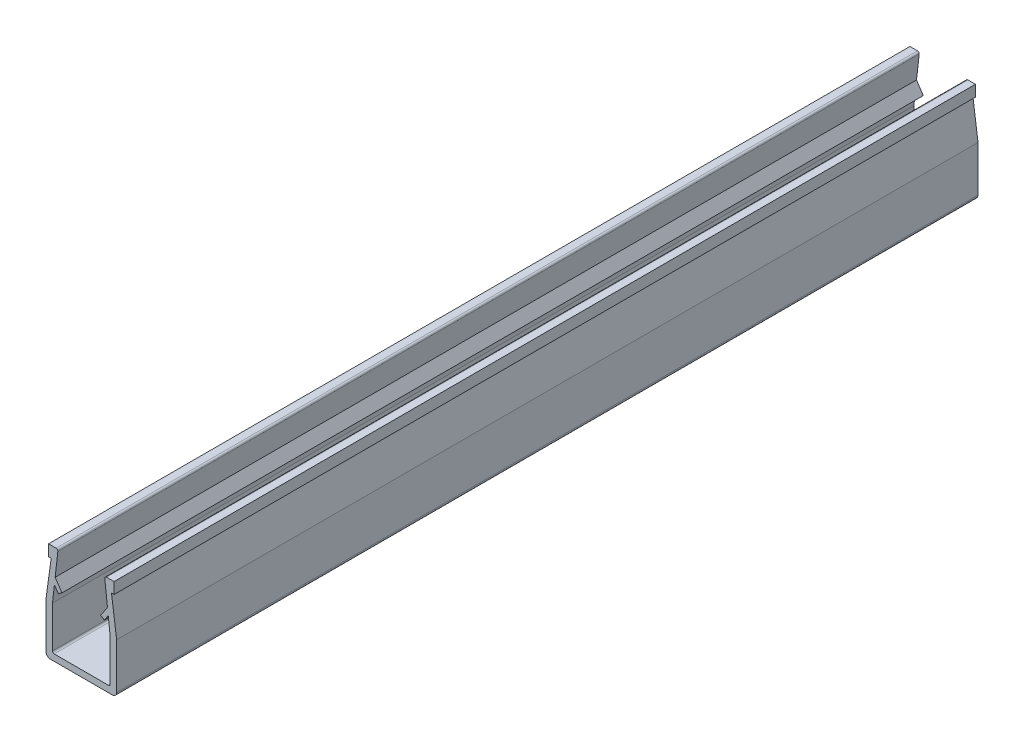
ISO-10303-21;
HEADER;
FILE_DESCRIPTION(('STEP AP214'),'2;1');
FILE_NAME('part.step','',(''),(''),'','','');
FILE_SCHEMA(('AUTOMOTIVE_DESIGN { 1 0 10303 214 1 1 1 1 }'));
ENDSEC;
DATA;
#1=APPLICATION_CONTEXT('core data for automotive mechanical design processes');
#2=APPLICATION_PROTOCOL_DEFINITION('international standard','automotive_design',2000,#1);
#3=PRODUCT_CONTEXT('',#1,'mechanical');
#4=PRODUCT('Part','Part','',(#3));
#5=PRODUCT_RELATED_PRODUCT_CATEGORY('part','',(#4));
#6=PRODUCT_DEFINITION_FORMATION('','',#4);
#7=PRODUCT_DEFINITION_CONTEXT('part definition',#1,'design');
#8=PRODUCT_DEFINITION('design','',#6,#7);
#9=PRODUCT_DEFINITION_SHAPE('','',#8);
#10=(LENGTH_UNIT() NAMED_UNIT(*) SI_UNIT(.MILLI.,.METRE.));
#11=(NAMED_UNIT(*) PLANE_ANGLE_UNIT() SI_UNIT($,.RADIAN.));
#12=(NAMED_UNIT(*) SI_UNIT($,.STERADIAN.) SOLID_ANGLE_UNIT());
#13=UNCERTAINTY_MEASURE_WITH_UNIT(LENGTH_MEASURE(1.E-05),#10,'distance_accuracy_value','');
#14=(GEOMETRIC_REPRESENTATION_CONTEXT(3) GLOBAL_UNCERTAINTY_ASSIGNED_CONTEXT((#13)) GLOBAL_UNIT_ASSIGNED_CONTEXT((#10,
#11,#12)) REPRESENTATION_CONTEXT('',''));
#15=CARTESIAN_POINT('',(0.,0.,0.));
#16=DIRECTION('',(0.,0.,1.));
#17=DIRECTION('',(1.,0.,0.));
#18=AXIS2_PLACEMENT_3D('',#15,#16,#17);
#19=CARTESIAN_POINT('',(0.,-1.29999999999995,100.));
#20=DIRECTION('',(0.,1.,0.));
#21=DIRECTION('',(0.,0.,1.));
#22=AXIS2_PLACEMENT_3D('',#19,#20,#21);
#23=PLANE('',#22);
#24=DIRECTION('',(1.,0.,0.));
#25=VECTOR('',#24,1.);
#26=CARTESIAN_POINT('',(0.,-1.29999999999995,0.));
#27=LINE('',#26,#25);
#28=CARTESIAN_POINT('',(0.,-1.29999999999995,0.));
#29=VERTEX_POINT('',#28);
#30=CARTESIAN_POINT('',(0.29826662995589,-1.29999999999995,0.));
#31=VERTEX_POINT('',#30);
#32=EDGE_CURVE('E263',#29,#31,#27,.T.);
#33=ORIENTED_EDGE('',*,*,#32,.T.);
#34=DIRECTION('',(0.,0.,-1.));
#35=VECTOR('',#34,1.);
#36=CARTESIAN_POINT('',(0.29826662995589,-1.29999999999995,100.));
#37=LINE('',#36,#35);
#38=CARTESIAN_POINT('',(0.29826662995589,-1.29999999999995,100.));
#39=VERTEX_POINT('',#38);
#40=EDGE_CURVE('E11',#39,#31,#37,.T.);
#41=ORIENTED_EDGE('',*,*,#40,.F.);
#42=DIRECTION('',(1.,0.,0.));
#43=VECTOR('',#42,1.);
#44=CARTESIAN_POINT('',(0.,-1.29999999999995,100.));
#45=LINE('',#44,#43);
#46=CARTESIAN_POINT('',(0.,-1.29999999999995,100.));
#47=VERTEX_POINT('',#46);
#48=EDGE_CURVE('E321',#47,#39,#45,.T.);
#49=ORIENTED_EDGE('',*,*,#48,.F.);
#50=DIRECTION('',(0.,0.,-1.));
#51=VECTOR('',#50,1.);
#52=CARTESIAN_POINT('',(0.,-1.29999999999995,100.));
#53=LINE('',#52,#51);
#54=EDGE_CURVE('E259',#47,#29,#53,.T.);
#55=ORIENTED_EDGE('',*,*,#54,.T.);
#56=EDGE_LOOP('',(#33,#41,#49,#55));
#57=FACE_BOUND('',#56,.T.);
#58=ADVANCED_FACE('F35',(#57),#23,.F.);
#59=CARTESIAN_POINT('',(-0.300000000000011,-5.70774326499407,100.));
#60=DIRECTION('',(0.99091392418748,-0.134497564481178,0.));
#61=DIRECTION('',(0.134497564481178,0.99091392418748,0.));
#62=AXIS2_PLACEMENT_3D('',#59,#60,#61);
#63=PLANE('',#62);
#64=DIRECTION('',(-0.134497564481178,-0.99091392418748,0.));
#65=VECTOR('',#64,1.);
#66=CARTESIAN_POINT('',(-0.300000000000011,-5.70774326499407,0.));
#67=LINE('',#66,#65);
#68=CARTESIAN_POINT('',(-0.300000000000011,-5.70774326499407,0.));
#69=VERTEX_POINT('',#68);
#70=EDGE_CURVE('E266',#31,#69,#67,.T.);
#71=ORIENTED_EDGE('',*,*,#70,.T.);
#72=DIRECTION('',(0.,0.,-1.));
#73=VECTOR('',#72,1.);
#74=CARTESIAN_POINT('',(-0.300000000000011,-5.70774326499407,100.));
#75=LINE('',#74,#73);
#76=CARTESIAN_POINT('',(-0.300000000000011,-5.70774326499407,100.));
#77=VERTEX_POINT('',#76);
#78=EDGE_CURVE('E43',#77,#69,#75,.T.);
#79=ORIENTED_EDGE('',*,*,#78,.F.);
#80=DIRECTION('',(-0.134497564481178,-0.99091392418748,0.));
#81=VECTOR('',#80,1.);
#82=CARTESIAN_POINT('',(-0.300000000000011,-5.70774326499407,100.));
#83=LINE('',#82,#81);
#84=EDGE_CURVE('E160',#39,#77,#83,.T.);
#85=ORIENTED_EDGE('',*,*,#84,.F.);
#86=ORIENTED_EDGE('',*,*,#40,.T.);
#87=EDGE_LOOP('',(#71,#79,#85,#86));
#88=FACE_BOUND('',#87,.T.);
#89=ADVANCED_FACE('F489',(#88),#63,.F.);
#90=CARTESIAN_POINT('',(-0.299999999999898,-11.,100.));
#91=DIRECTION('',(1.,0.,0.));
#92=DIRECTION('',(0.,1.,0.));
#93=AXIS2_PLACEMENT_3D('',#90,#91,#92);
#94=PLANE('',#93);
#95=DIRECTION('',(0.,-1.,0.));
#96=VECTOR('',#95,1.);
#97=CARTESIAN_POINT('',(-0.299999999999898,-11.,0.));
#98=LINE('',#97,#96);
#99=CARTESIAN_POINT('',(-0.299999999999898,-11.,0.));
#100=VERTEX_POINT('',#99);
#101=EDGE_CURVE('E268',#69,#100,#98,.T.);
#102=ORIENTED_EDGE('',*,*,#101,.T.);
#103=DIRECTION('',(0.,0.,-1.));
#104=VECTOR('',#103,1.);
#105=CARTESIAN_POINT('',(-0.299999999999898,-11.,100.));
#106=LINE('',#105,#104);
#107=CARTESIAN_POINT('',(-0.299999999999898,-11.,100.));
#108=VERTEX_POINT('',#107);
#109=EDGE_CURVE('E394',#108,#100,#106,.T.);
#110=ORIENTED_EDGE('',*,*,#109,.F.);
#111=DIRECTION('',(0.,-1.,0.));
#112=VECTOR('',#111,1.);
#113=CARTESIAN_POINT('',(-0.299999999999898,-11.,100.));
#114=LINE('',#113,#112);
#115=EDGE_CURVE('E402',#77,#108,#114,.T.);
#116=ORIENTED_EDGE('',*,*,#115,.F.);
#117=ORIENTED_EDGE('',*,*,#78,.T.);
#118=EDGE_LOOP('',(#102,#110,#116,#117));
#119=FACE_BOUND('',#118,.T.);
#120=ADVANCED_FACE('F400',(#119),#94,.F.);
#121=CARTESIAN_POINT('',(0.200000000000102,-11.,100.));
#122=DIRECTION('',(0.,0.,-1.));
#123=DIRECTION('',(-1.,0.,0.));
#124=AXIS2_PLACEMENT_3D('',#121,#122,#123);
#125=CYLINDRICAL_SURFACE('',#124,0.5);
#126=CARTESIAN_POINT('',(0.200000000000102,-11.,0.));
#127=DIRECTION('',(0.,0.,1.));
#128=DIRECTION('',(1.,0.,0.));
#129=AXIS2_PLACEMENT_3D('',#126,#127,#128);
#130=CIRCLE('',#129,0.5);
#131=CARTESIAN_POINT('',(0.200000000000102,-11.5,0.));
#132=VERTEX_POINT('',#131);
#133=EDGE_CURVE('E270',#100,#132,#130,.T.);
#134=ORIENTED_EDGE('',*,*,#133,.T.);
#135=DIRECTION('',(0.,0.,-1.));
#136=VECTOR('',#135,1.);
#137=CARTESIAN_POINT('',(0.200000000000102,-11.5,100.));
#138=LINE('',#137,#136);
#139=CARTESIAN_POINT('',(0.200000000000102,-11.5,100.));
#140=VERTEX_POINT('',#139);
#141=EDGE_CURVE('E391',#140,#132,#138,.T.);
#142=ORIENTED_EDGE('',*,*,#141,.F.);
#143=CARTESIAN_POINT('',(0.200000000000102,-11.,100.));
#144=DIRECTION('',(0.,0.,1.));
#145=DIRECTION('',(1.,0.,0.));
#146=AXIS2_PLACEMENT_3D('',#143,#144,#145);
#147=CIRCLE('',#146,0.5);
#148=EDGE_CURVE('E420',#108,#140,#147,.T.);
#149=ORIENTED_EDGE('',*,*,#148,.F.);
#150=ORIENTED_EDGE('',*,*,#109,.T.);
#151=EDGE_LOOP('',(#134,#142,#149,#150));
#152=FACE_BOUND('',#151,.T.);
#153=ADVANCED_FACE('F411',(#152),#125,.T.);
#154=CARTESIAN_POINT('',(7.39999999999992,-11.5,100.));
#155=DIRECTION('',(0.,1.,0.));
#156=DIRECTION('',(0.,0.,1.));
#157=AXIS2_PLACEMENT_3D('',#154,#155,#156);
#158=PLANE('',#157);
#159=DIRECTION('',(1.,0.,0.));
#160=VECTOR('',#159,1.);
#161=CARTESIAN_POINT('',(7.39999999999992,-11.5,0.));
#162=LINE('',#161,#160);
#163=CARTESIAN_POINT('',(7.39999999999992,-11.5,0.));
#164=VERTEX_POINT('',#163);
#165=EDGE_CURVE('E272',#132,#164,#162,.T.);
#166=ORIENTED_EDGE('',*,*,#165,.T.);
#167=DIRECTION('',(0.,0.,-1.));
#168=VECTOR('',#167,1.);
#169=CARTESIAN_POINT('',(7.39999999999992,-11.5,100.));
#170=LINE('',#169,#168);
#171=CARTESIAN_POINT('',(7.39999999999992,-11.5,100.));
#172=VERTEX_POINT('',#171);
#173=EDGE_CURVE('E388',#172,#164,#170,.T.);
#174=ORIENTED_EDGE('',*,*,#173,.F.);
#175=DIRECTION('',(1.,0.,0.));
#176=VECTOR('',#175,1.);
#177=CARTESIAN_POINT('',(7.39999999999992,-11.5,100.));
#178=LINE('',#177,#176);
#179=EDGE_CURVE('E417',#140,#172,#178,.T.);
#180=ORIENTED_EDGE('',*,*,#179,.F.);
#181=ORIENTED_EDGE('',*,*,#141,.T.);
#182=EDGE_LOOP('',(#166,#174,#180,#181));
#183=FACE_BOUND('',#182,.T.);
#184=ADVANCED_FACE('F415',(#183),#158,.F.);
#185=CARTESIAN_POINT('',(7.39999999999992,-11.,100.));
#186=DIRECTION('',(0.,0.,-1.));
#187=DIRECTION('',(-1.,0.,0.));
#188=AXIS2_PLACEMENT_3D('',#185,#186,#187);
#189=CYLINDRICAL_SURFACE('',#188,0.5);
#190=CARTESIAN_POINT('',(7.39999999999992,-11.,0.));
#191=DIRECTION('',(0.,0.,1.));
#192=DIRECTION('',(1.,0.,0.));
#193=AXIS2_PLACEMENT_3D('',#190,#191,#192);
#194=CIRCLE('',#193,0.5);
#195=CARTESIAN_POINT('',(7.89999999999992,-11.,0.));
#196=VERTEX_POINT('',#195);
#197=EDGE_CURVE('E274',#164,#196,#194,.T.);
#198=ORIENTED_EDGE('',*,*,#197,.T.);
#199=DIRECTION('',(0.,0.,-1.));
#200=VECTOR('',#199,1.);
#201=CARTESIAN_POINT('',(7.89999999999992,-11.,100.));
#202=LINE('',#201,#200);
#203=CARTESIAN_POINT('',(7.89999999999992,-11.,100.));
#204=VERTEX_POINT('',#203);
#205=EDGE_CURVE('E385',#204,#196,#202,.T.);
#206=ORIENTED_EDGE('',*,*,#205,.F.);
#207=CARTESIAN_POINT('',(7.39999999999992,-11.,100.));
#208=DIRECTION('',(0.,0.,1.));
#209=DIRECTION('',(1.,0.,0.));
#210=AXIS2_PLACEMENT_3D('',#207,#208,#209);
#211=CIRCLE('',#210,0.5);
#212=EDGE_CURVE('E419',#172,#204,#211,.T.);
#213=ORIENTED_EDGE('',*,*,#212,.F.);
#214=ORIENTED_EDGE('',*,*,#173,.T.);
#215=EDGE_LOOP('',(#198,#206,#213,#214));
#216=FACE_BOUND('',#215,.T.);
#217=ADVANCED_FACE('F502',(#216),#189,.T.);
#218=CARTESIAN_POINT('',(7.90000000000003,-5.70774326499407,100.));
#219=DIRECTION('',(-1.,0.,0.));
#220=DIRECTION('',(0.,-1.,0.));
#221=AXIS2_PLACEMENT_3D('',#218,#219,#220);
#222=PLANE('',#221);
#223=DIRECTION('',(0.,1.,0.));
#224=VECTOR('',#223,1.);
#225=CARTESIAN_POINT('',(7.90000000000003,-5.70774326499407,0.));
#226=LINE('',#225,#224);
#227=CARTESIAN_POINT('',(7.90000000000003,-5.70774326499407,0.));
#228=VERTEX_POINT('',#227);
#229=EDGE_CURVE('E276',#196,#228,#226,.T.);
#230=ORIENTED_EDGE('',*,*,#229,.T.);
#231=DIRECTION('',(0.,0.,-1.));
#232=VECTOR('',#231,1.);
#233=CARTESIAN_POINT('',(7.90000000000003,-5.70774326499407,100.));
#234=LINE('',#233,#232);
#235=CARTESIAN_POINT('',(7.90000000000003,-5.70774326499407,100.));
#236=VERTEX_POINT('',#235);
#237=EDGE_CURVE('E382',#236,#228,#234,.T.);
#238=ORIENTED_EDGE('',*,*,#237,.F.);
#239=DIRECTION('',(0.,1.,0.));
#240=VECTOR('',#239,1.);
#241=CARTESIAN_POINT('',(7.90000000000003,-5.70774326499407,100.));
#242=LINE('',#241,#240);
#243=EDGE_CURVE('E422',#204,#236,#242,.T.);
#244=ORIENTED_EDGE('',*,*,#243,.F.);
#245=ORIENTED_EDGE('',*,*,#205,.T.);
#246=EDGE_LOOP('',(#230,#238,#244,#245));
#247=FACE_BOUND('',#246,.T.);
#248=ADVANCED_FACE('F505',(#247),#222,.F.);
#249=CARTESIAN_POINT('',(7.30173337004413,-1.29999999999995,100.));
#250=DIRECTION('',(-0.99091392418748,-0.134497564481177,0.));
#251=DIRECTION('',(0.134497564481177,-0.99091392418748,0.));
#252=AXIS2_PLACEMENT_3D('',#249,#250,#251);
#253=PLANE('',#252);
#254=DIRECTION('',(-0.134497564481177,0.99091392418748,0.));
#255=VECTOR('',#254,1.);
#256=CARTESIAN_POINT('',(7.30173337004413,-1.29999999999995,0.));
#257=LINE('',#256,#255);
#258=CARTESIAN_POINT('',(7.30173337004413,-1.29999999999995,0.));
#259=VERTEX_POINT('',#258);
#260=EDGE_CURVE('E278',#228,#259,#257,.T.);
#261=ORIENTED_EDGE('',*,*,#260,.T.);
#262=DIRECTION('',(0.,0.,-1.));
#263=VECTOR('',#262,1.);
#264=CARTESIAN_POINT('',(7.30173337004413,-1.29999999999995,100.));
#265=LINE('',#264,#263);
#266=CARTESIAN_POINT('',(7.30173337004413,-1.29999999999995,100.));
#267=VERTEX_POINT('',#266);
#268=EDGE_CURVE('E379',#267,#259,#265,.T.);
#269=ORIENTED_EDGE('',*,*,#268,.F.);
#270=DIRECTION('',(-0.134497564481177,0.99091392418748,0.));
#271=VECTOR('',#270,1.);
#272=CARTESIAN_POINT('',(7.30173337004413,-1.29999999999995,100.));
#273=LINE('',#272,#271);
#274=EDGE_CURVE('E428',#236,#267,#273,.T.);
#275=ORIENTED_EDGE('',*,*,#274,.F.);
#276=ORIENTED_EDGE('',*,*,#237,.T.);
#277=EDGE_LOOP('',(#261,#269,#275,#276));
#278=FACE_BOUND('',#277,.T.);
#279=ADVANCED_FACE('F509',(#278),#253,.F.);
#280=CARTESIAN_POINT('',(7.30173337004413,-1.29999999999995,100.));
#281=DIRECTION('',(0.,1.,0.));
#282=DIRECTION('',(0.,0.,1.));
#283=AXIS2_PLACEMENT_3D('',#280,#281,#282);
#284=PLANE('',#283);
#285=DIRECTION('',(1.,0.,0.));
#286=VECTOR('',#285,1.);
#287=CARTESIAN_POINT('',(7.30173337004413,-1.29999999999995,0.));
#288=LINE('',#287,#286);
#289=CARTESIAN_POINT('',(7.60000000000002,-1.29999999999995,0.));
#290=VERTEX_POINT('',#289);
#291=EDGE_CURVE('E280',#259,#290,#288,.T.);
#292=ORIENTED_EDGE('',*,*,#291,.T.);
#293=DIRECTION('',(0.,0.,-1.));
#294=VECTOR('',#293,1.);
#295=CARTESIAN_POINT('',(7.60000000000002,-1.29999999999995,100.));
#296=LINE('',#295,#294);
#297=CARTESIAN_POINT('',(7.60000000000002,-1.29999999999995,100.));
#298=VERTEX_POINT('',#297);
#299=EDGE_CURVE('E376',#298,#290,#296,.T.);
#300=ORIENTED_EDGE('',*,*,#299,.F.);
#301=DIRECTION('',(1.,0.,0.));
#302=VECTOR('',#301,1.);
#303=CARTESIAN_POINT('',(7.30173337004413,-1.29999999999995,100.));
#304=LINE('',#303,#302);
#305=EDGE_CURVE('E430',#267,#298,#304,.T.);
#306=ORIENTED_EDGE('',*,*,#305,.F.);
#307=ORIENTED_EDGE('',*,*,#268,.T.);
#308=EDGE_LOOP('',(#292,#300,#306,#307));
#309=FACE_BOUND('',#308,.T.);
#310=ADVANCED_FACE('F513',(#309),#284,.F.);
#311=CARTESIAN_POINT('',(7.60000000000002,0.,100.));
#312=DIRECTION('',(-1.,0.,0.));
#313=DIRECTION('',(0.,0.,1.));
#314=AXIS2_PLACEMENT_3D('',#311,#312,#313);
#315=PLANE('',#314);
#316=DIRECTION('',(0.,1.,0.));
#317=VECTOR('',#316,1.);
#318=CARTESIAN_POINT('',(7.60000000000002,0.,0.));
#319=LINE('',#318,#317);
#320=CARTESIAN_POINT('',(7.60000000000002,0.,0.));
#321=VERTEX_POINT('',#320);
#322=EDGE_CURVE('E282',#290,#321,#319,.T.);
#323=ORIENTED_EDGE('',*,*,#322,.T.);
#324=DIRECTION('',(0.,0.,-1.));
#325=VECTOR('',#324,1.);
#326=CARTESIAN_POINT('',(7.60000000000002,0.,100.));
#327=LINE('',#326,#325);
#328=CARTESIAN_POINT('',(7.60000000000002,0.,100.));
#329=VERTEX_POINT('',#328);
#330=EDGE_CURVE('E373',#329,#321,#327,.T.);
#331=ORIENTED_EDGE('',*,*,#330,.F.);
#332=DIRECTION('',(0.,1.,0.));
#333=VECTOR('',#332,1.);
#334=CARTESIAN_POINT('',(7.60000000000002,0.,100.));
#335=LINE('',#334,#333);
#336=EDGE_CURVE('E432',#298,#329,#335,.T.);
#337=ORIENTED_EDGE('',*,*,#336,.F.);
#338=ORIENTED_EDGE('',*,*,#299,.T.);
#339=EDGE_LOOP('',(#323,#331,#337,#338));
#340=FACE_BOUND('',#339,.T.);
#341=ADVANCED_FACE('F517',(#340),#315,.F.);
#342=CARTESIAN_POINT('',(7.60000000000002,0.,100.));
#343=DIRECTION('',(0.,-1.,0.));
#344=DIRECTION('',(0.,0.,-1.));
#345=AXIS2_PLACEMENT_3D('',#342,#343,#344);
#346=PLANE('',#345);
#347=DIRECTION('',(-1.,0.,0.));
#348=VECTOR('',#347,1.);
#349=CARTESIAN_POINT('',(7.60000000000002,0.,0.));
#350=LINE('',#349,#348);
#351=CARTESIAN_POINT('',(6.72388252186681,0.,0.));
#352=VERTEX_POINT('',#351);
#353=EDGE_CURVE('E284',#321,#352,#350,.T.);
#354=ORIENTED_EDGE('',*,*,#353,.T.);
#355=DIRECTION('',(0.,0.,-1.));
#356=VECTOR('',#355,1.);
#357=CARTESIAN_POINT('',(6.72388252186681,0.,100.));
#358=LINE('',#357,#356);
#359=CARTESIAN_POINT('',(6.72388252186681,0.,100.));
#360=VERTEX_POINT('',#359);
#361=EDGE_CURVE('E370',#360,#352,#358,.T.);
#362=ORIENTED_EDGE('',*,*,#361,.F.);
#363=DIRECTION('',(-1.,0.,0.));
#364=VECTOR('',#363,1.);
#365=CARTESIAN_POINT('',(7.60000000000002,0.,100.));
#366=LINE('',#365,#364);
#367=EDGE_CURVE('E434',#329,#360,#366,.T.);
#368=ORIENTED_EDGE('',*,*,#367,.F.);
#369=ORIENTED_EDGE('',*,*,#330,.T.);
#370=EDGE_LOOP('',(#354,#362,#368,#369));
#371=FACE_BOUND('',#370,.T.);
#372=ADVANCED_FACE('F521',(#371),#346,.F.);
#373=CARTESIAN_POINT('',(6.72388252186686,-0.200000000000042,100.));
#374=DIRECTION('',(0.,0.,-1.));
#375=DIRECTION('',(-1.,0.,0.));
#376=AXIS2_PLACEMENT_3D('',#373,#374,#375);
#377=CYLINDRICAL_SURFACE('',#376,0.200000000000042);
#378=CARTESIAN_POINT('',(6.72388252186686,-0.200000000000042,0.));
#379=DIRECTION('',(0.,0.,1.));
#380=DIRECTION('',(1.,0.,0.));
#381=AXIS2_PLACEMENT_3D('',#378,#379,#380);
#382=CIRCLE('',#381,0.200000000000042);
#383=CARTESIAN_POINT('',(6.52514828626215,-0.222465609242363,0.));
#384=VERTEX_POINT('',#383);
#385=EDGE_CURVE('E286',#352,#384,#382,.T.);
#386=ORIENTED_EDGE('',*,*,#385,.T.);
#387=DIRECTION('',(0.,0.,-1.));
#388=VECTOR('',#387,1.);
#389=CARTESIAN_POINT('',(6.52514828626215,-0.222465609242363,100.));
#390=LINE('',#389,#388);
#391=CARTESIAN_POINT('',(6.52514828626215,-0.222465609242363,100.));
#392=VERTEX_POINT('',#391);
#393=EDGE_CURVE('E367',#392,#384,#390,.T.);
#394=ORIENTED_EDGE('',*,*,#393,.F.);
#395=CARTESIAN_POINT('',(6.72388252186686,-0.200000000000042,100.));
#396=DIRECTION('',(0.,0.,1.));
#397=DIRECTION('',(1.,0.,0.));
#398=AXIS2_PLACEMENT_3D('',#395,#396,#397);
#399=CIRCLE('',#398,0.200000000000042);
#400=EDGE_CURVE('E436',#360,#392,#399,.T.);
#401=ORIENTED_EDGE('',*,*,#400,.F.);
#402=ORIENTED_EDGE('',*,*,#361,.T.);
#403=EDGE_LOOP('',(#386,#394,#401,#402));
#404=FACE_BOUND('',#403,.T.);
#405=ADVANCED_FACE('F525',(#404),#377,.T.);
#406=CARTESIAN_POINT('',(6.52514828626215,-0.222465609242363,100.));
#407=DIRECTION('',(0.993671178023364,0.112328046211358,0.));
#408=DIRECTION('',(-0.112328046211358,0.993671178023364,0.));
#409=AXIS2_PLACEMENT_3D('',#406,#407,#408);
#410=PLANE('',#409);
#411=DIRECTION('',(0.112328046211358,-0.993671178023363,0.));
#412=VECTOR('',#411,1.);
#413=CARTESIAN_POINT('',(6.52514828626215,-0.222465609242363,0.));
#414=LINE('',#413,#412);
#415=CARTESIAN_POINT('',(6.83757414313112,-2.98623280462118,0.));
#416=VERTEX_POINT('',#415);
#417=EDGE_CURVE('E288',#384,#416,#414,.T.);
#418=ORIENTED_EDGE('',*,*,#417,.T.);
#419=DIRECTION('',(0.,0.,-1.));
#420=VECTOR('',#419,1.);
#421=CARTESIAN_POINT('',(6.83757414313112,-2.98623280462118,100.));
#422=LINE('',#421,#420);
#423=CARTESIAN_POINT('',(6.83757414313112,-2.98623280462118,100.));
#424=VERTEX_POINT('',#423);
#425=EDGE_CURVE('E364',#424,#416,#422,.T.);
#426=ORIENTED_EDGE('',*,*,#425,.F.);
#427=DIRECTION('',(0.112328046211358,-0.993671178023363,0.));
#428=VECTOR('',#427,1.);
#429=CARTESIAN_POINT('',(6.52514828626215,-0.222465609242363,100.));
#430=LINE('',#429,#428);
#431=EDGE_CURVE('E438',#392,#424,#430,.T.);
#432=ORIENTED_EDGE('',*,*,#431,.F.);
#433=ORIENTED_EDGE('',*,*,#393,.T.);
#434=EDGE_LOOP('',(#418,#426,#432,#433));
#435=FACE_BOUND('',#434,.T.);
#436=ADVANCED_FACE('F529',(#435),#410,.F.);
#437=CARTESIAN_POINT('',(6.83757414313112,-2.98623280462118,100.));
#438=DIRECTION('',(0.831548335352007,-0.555452397576341,0.));
#439=DIRECTION('',(0.555452397576341,0.831548335352007,0.));
#440=AXIS2_PLACEMENT_3D('',#437,#438,#439);
#441=PLANE('',#440);
#442=DIRECTION('',(-0.555452397576341,-0.831548335352007,0.));
#443=VECTOR('',#442,1.);
#444=CARTESIAN_POINT('',(6.83757414313112,-2.98623280462118,0.));
#445=LINE('',#444,#443);
#446=CARTESIAN_POINT('',(6.05000000000001,-4.16528247754468,0.));
#447=VERTEX_POINT('',#446);
#448=EDGE_CURVE('E290',#416,#447,#445,.T.);
#449=ORIENTED_EDGE('',*,*,#448,.T.);
#450=DIRECTION('',(0.,0.,-1.));
#451=VECTOR('',#450,1.);
#452=CARTESIAN_POINT('',(6.05000000000001,-4.16528247754468,100.));
#453=LINE('',#452,#451);
#454=CARTESIAN_POINT('',(6.05000000000001,-4.16528247754468,100.));
#455=VERTEX_POINT('',#454);
#456=EDGE_CURVE('E361',#455,#447,#453,.T.);
#457=ORIENTED_EDGE('',*,*,#456,.F.);
#458=DIRECTION('',(-0.555452397576341,-0.831548335352007,0.));
#459=VECTOR('',#458,1.);
#460=CARTESIAN_POINT('',(6.83757414313112,-2.98623280462118,100.));
#461=LINE('',#460,#459);
#462=EDGE_CURVE('E440',#424,#455,#461,.T.);
#463=ORIENTED_EDGE('',*,*,#462,.F.);
#464=ORIENTED_EDGE('',*,*,#425,.T.);
#465=EDGE_LOOP('',(#449,#457,#463,#464));
#466=FACE_BOUND('',#465,.T.);
#467=ADVANCED_FACE('F533',(#466),#441,.F.);
#468=CARTESIAN_POINT('',(6.05000000000001,-4.16528247754468,100.));
#469=DIRECTION('',(0.55545239757642,0.831548335351954,0.));
#470=DIRECTION('',(-0.831548335351954,0.55545239757642,0.));
#471=AXIS2_PLACEMENT_3D('',#468,#469,#470);
#472=PLANE('',#471);
#473=DIRECTION('',(0.831548335351954,-0.55545239757642,0.));
#474=VECTOR('',#473,1.);
#475=CARTESIAN_POINT('',(6.05000000000001,-4.16528247754468,0.));
#476=LINE('',#475,#474);
#477=CARTESIAN_POINT('',(6.4657741676761,-4.44300867633297,0.));
#478=VERTEX_POINT('',#477);
#479=EDGE_CURVE('E292',#447,#478,#476,.T.);
#480=ORIENTED_EDGE('',*,*,#479,.T.);
#481=DIRECTION('',(0.,0.,-1.));
#482=VECTOR('',#481,1.);
#483=CARTESIAN_POINT('',(6.4657741676761,-4.44300867633297,100.));
#484=LINE('',#483,#482);
#485=CARTESIAN_POINT('',(6.4657741676761,-4.44300867633297,100.));
#486=VERTEX_POINT('',#485);
#487=EDGE_CURVE('E358',#486,#478,#484,.T.);
#488=ORIENTED_EDGE('',*,*,#487,.F.);
#489=DIRECTION('',(0.831548335351954,-0.55545239757642,0.));
#490=VECTOR('',#489,1.);
#491=CARTESIAN_POINT('',(6.05000000000001,-4.16528247754468,100.));
#492=LINE('',#491,#490);
#493=EDGE_CURVE('E442',#455,#486,#492,.T.);
#494=ORIENTED_EDGE('',*,*,#493,.F.);
#495=ORIENTED_EDGE('',*,*,#456,.T.);
#496=EDGE_LOOP('',(#480,#488,#494,#495));
#497=FACE_BOUND('',#496,.T.);
#498=ADVANCED_FACE('F537',(#497),#472,.F.);
#499=CARTESIAN_POINT('',(6.9246038349167,-3.7561108473401,100.));
#500=DIRECTION('',(-0.831548335352035,0.555452397576299,0.));
#501=DIRECTION('',(-0.555452397576299,-0.831548335352035,0.));
#502=AXIS2_PLACEMENT_3D('',#499,#500,#501);
#503=PLANE('',#502);
#504=DIRECTION('',(0.555452397576299,0.831548335352035,0.));
#505=VECTOR('',#504,1.);
#506=CARTESIAN_POINT('',(6.9246038349167,-3.7561108473401,0.));
#507=LINE('',#506,#505);
#508=CARTESIAN_POINT('',(6.9246038349167,-3.7561108473401,0.));
#509=VERTEX_POINT('',#508);
#510=EDGE_CURVE('E294',#478,#509,#507,.T.);
#511=ORIENTED_EDGE('',*,*,#510,.T.);
#512=DIRECTION('',(0.,0.,-1.));
#513=VECTOR('',#512,1.);
#514=CARTESIAN_POINT('',(6.9246038349167,-3.7561108473401,100.));
#515=LINE('',#514,#513);
#516=CARTESIAN_POINT('',(6.9246038349167,-3.7561108473401,100.));
#517=VERTEX_POINT('',#516);
#518=EDGE_CURVE('E355',#517,#509,#515,.T.);
#519=ORIENTED_EDGE('',*,*,#518,.F.);
#520=DIRECTION('',(0.555452397576299,0.831548335352035,0.));
#521=VECTOR('',#520,1.);
#522=CARTESIAN_POINT('',(6.9246038349167,-3.7561108473401,100.));
#523=LINE('',#522,#521);
#524=EDGE_CURVE('E444',#486,#517,#523,.T.);
#525=ORIENTED_EDGE('',*,*,#524,.F.);
#526=ORIENTED_EDGE('',*,*,#487,.T.);
#527=EDGE_LOOP('',(#511,#519,#525,#526));
#528=FACE_BOUND('',#527,.T.);
#529=ADVANCED_FACE('F541',(#528),#503,.F.);
#530=CARTESIAN_POINT('',(6.9246038349167,-3.7561108473401,100.));
#531=DIRECTION('',(0.993671178023363,0.112328046211359,0.));
#532=DIRECTION('',(-0.112328046211359,0.993671178023363,0.));
#533=AXIS2_PLACEMENT_3D('',#530,#531,#532);
#534=PLANE('',#533);
#535=DIRECTION('',(0.112328046211359,-0.993671178023363,0.));
#536=VECTOR('',#535,1.);
#537=CARTESIAN_POINT('',(6.9246038349167,-3.7561108473401,0.));
#538=LINE('',#537,#536);
#539=CARTESIAN_POINT('',(7.15000000000003,-5.75,0.));
#540=VERTEX_POINT('',#539);
#541=EDGE_CURVE('E296',#509,#540,#538,.T.);
#542=ORIENTED_EDGE('',*,*,#541,.T.);
#543=DIRECTION('',(0.,0.,-1.));
#544=VECTOR('',#543,1.);
#545=CARTESIAN_POINT('',(7.15000000000003,-5.75,100.));
#546=LINE('',#545,#544);
#547=CARTESIAN_POINT('',(7.15000000000003,-5.75,100.));
#548=VERTEX_POINT('',#547);
#549=EDGE_CURVE('E352',#548,#540,#546,.T.);
#550=ORIENTED_EDGE('',*,*,#549,.F.);
#551=DIRECTION('',(0.112328046211359,-0.993671178023363,0.));
#552=VECTOR('',#551,1.);
#553=CARTESIAN_POINT('',(6.9246038349167,-3.7561108473401,100.));
#554=LINE('',#553,#552);
#555=EDGE_CURVE('E446',#517,#548,#554,.T.);
#556=ORIENTED_EDGE('',*,*,#555,.F.);
#557=ORIENTED_EDGE('',*,*,#518,.T.);
#558=EDGE_LOOP('',(#542,#550,#556,#557));
#559=FACE_BOUND('',#558,.T.);
#560=ADVANCED_FACE('F545',(#559),#534,.F.);
#561=CARTESIAN_POINT('',(7.15000000000003,-5.75,100.));
#562=DIRECTION('',(1.,0.,0.));
#563=DIRECTION('',(0.,1.,0.));
#564=AXIS2_PLACEMENT_3D('',#561,#562,#563);
#565=PLANE('',#564);
#566=DIRECTION('',(0.,-1.,0.));
#567=VECTOR('',#566,1.);
#568=CARTESIAN_POINT('',(7.15000000000003,-5.75,0.));
#569=LINE('',#568,#567);
#570=CARTESIAN_POINT('',(7.14999999999992,-10.55,0.));
#571=VERTEX_POINT('',#570);
#572=EDGE_CURVE('E298',#540,#571,#569,.T.);
#573=ORIENTED_EDGE('',*,*,#572,.T.);
#574=DIRECTION('',(0.,0.,-1.));
#575=VECTOR('',#574,1.);
#576=CARTESIAN_POINT('',(7.14999999999992,-10.55,100.));
#577=LINE('',#576,#575);
#578=CARTESIAN_POINT('',(7.14999999999992,-10.55,100.));
#579=VERTEX_POINT('',#578);
#580=EDGE_CURVE('E349',#579,#571,#577,.T.);
#581=ORIENTED_EDGE('',*,*,#580,.F.);
#582=DIRECTION('',(0.,-1.,0.));
#583=VECTOR('',#582,1.);
#584=CARTESIAN_POINT('',(7.15000000000003,-5.75,100.));
#585=LINE('',#584,#583);
#586=EDGE_CURVE('E448',#548,#579,#585,.T.);
#587=ORIENTED_EDGE('',*,*,#586,.F.);
#588=ORIENTED_EDGE('',*,*,#549,.T.);
#589=EDGE_LOOP('',(#573,#581,#587,#588));
#590=FACE_BOUND('',#589,.T.);
#591=ADVANCED_FACE('F549',(#590),#565,.F.);
#592=CARTESIAN_POINT('',(6.9499999999999,-10.55,100.));
#593=DIRECTION('',(0.,0.,-1.));
#594=DIRECTION('',(-1.,0.,0.));
#595=AXIS2_PLACEMENT_3D('',#592,#593,#594);
#596=CYLINDRICAL_SURFACE('',#595,0.200000000000018);
#597=CARTESIAN_POINT('',(6.9499999999999,-10.55,0.));
#598=DIRECTION('',(0.,0.,-1.));
#599=DIRECTION('',(1.,0.,0.));
#600=AXIS2_PLACEMENT_3D('',#597,#598,#599);
#601=CIRCLE('',#600,0.200000000000018);
#602=CARTESIAN_POINT('',(6.94999999999993,-10.75,0.));
#603=VERTEX_POINT('',#602);
#604=EDGE_CURVE('E300',#571,#603,#601,.T.);
#605=ORIENTED_EDGE('',*,*,#604,.T.);
#606=DIRECTION('',(0.,0.,-1.));
#607=VECTOR('',#606,1.);
#608=CARTESIAN_POINT('',(6.94999999999993,-10.75,100.));
#609=LINE('',#608,#607);
#610=CARTESIAN_POINT('',(6.94999999999993,-10.75,100.));
#611=VERTEX_POINT('',#610);
#612=EDGE_CURVE('E346',#611,#603,#609,.T.);
#613=ORIENTED_EDGE('',*,*,#612,.F.);
#614=CARTESIAN_POINT('',(6.9499999999999,-10.55,100.));
#615=DIRECTION('',(0.,0.,-1.));
#616=DIRECTION('',(1.,0.,0.));
#617=AXIS2_PLACEMENT_3D('',#614,#615,#616);
#618=CIRCLE('',#617,0.200000000000018);
#619=EDGE_CURVE('E450',#579,#611,#618,.T.);
#620=ORIENTED_EDGE('',*,*,#619,.F.);
#621=ORIENTED_EDGE('',*,*,#580,.T.);
#622=EDGE_LOOP('',(#605,#613,#620,#621));
#623=FACE_BOUND('',#622,.T.);
#624=ADVANCED_FACE('F553',(#623),#596,.F.);
#625=CARTESIAN_POINT('',(6.94999999999993,-10.75,100.));
#626=DIRECTION('',(0.,-1.,0.));
#627=DIRECTION('',(0.,0.,-1.));
#628=AXIS2_PLACEMENT_3D('',#625,#626,#627);
#629=PLANE('',#628);
#630=DIRECTION('',(-1.,0.,0.));
#631=VECTOR('',#630,1.);
#632=CARTESIAN_POINT('',(6.94999999999993,-10.75,0.));
#633=LINE('',#632,#631);
#634=CARTESIAN_POINT('',(0.650000000000034,-10.75,0.));
#635=VERTEX_POINT('',#634);
#636=EDGE_CURVE('E302',#603,#635,#633,.T.);
#637=ORIENTED_EDGE('',*,*,#636,.T.);
#638=DIRECTION('',(0.,0.,-1.));
#639=VECTOR('',#638,1.);
#640=CARTESIAN_POINT('',(0.650000000000034,-10.75,100.));
#641=LINE('',#640,#639);
#642=CARTESIAN_POINT('',(0.650000000000034,-10.75,100.));
#643=VERTEX_POINT('',#642);
#644=EDGE_CURVE('E343',#643,#635,#641,.T.);
#645=ORIENTED_EDGE('',*,*,#644,.F.);
#646=DIRECTION('',(-1.,0.,0.));
#647=VECTOR('',#646,1.);
#648=CARTESIAN_POINT('',(6.94999999999993,-10.75,100.));
#649=LINE('',#648,#647);
#650=EDGE_CURVE('E452',#611,#643,#649,.T.);
#651=ORIENTED_EDGE('',*,*,#650,.F.);
#652=ORIENTED_EDGE('',*,*,#612,.T.);
#653=EDGE_LOOP('',(#637,#645,#651,#652));
#654=FACE_BOUND('',#653,.T.);
#655=ADVANCED_FACE('F557',(#654),#629,.F.);
#656=CARTESIAN_POINT('',(0.650000000000063,-10.55,100.));
#657=DIRECTION('',(0.,0.,-1.));
#658=DIRECTION('',(-1.,0.,0.));
#659=AXIS2_PLACEMENT_3D('',#656,#657,#658);
#660=CYLINDRICAL_SURFACE('',#659,0.200000000000017);
#661=CARTESIAN_POINT('',(0.650000000000063,-10.55,0.));
#662=DIRECTION('',(0.,0.,-1.));
#663=DIRECTION('',(1.,0.,0.));
#664=AXIS2_PLACEMENT_3D('',#661,#662,#663);
#665=CIRCLE('',#664,0.200000000000017);
#666=CARTESIAN_POINT('',(0.450000000000045,-10.55,0.));
#667=VERTEX_POINT('',#666);
#668=EDGE_CURVE('E304',#635,#667,#665,.T.);
#669=ORIENTED_EDGE('',*,*,#668,.T.);
#670=DIRECTION('',(0.,0.,-1.));
#671=VECTOR('',#670,1.);
#672=CARTESIAN_POINT('',(0.450000000000045,-10.55,100.));
#673=LINE('',#672,#671);
#674=CARTESIAN_POINT('',(0.450000000000045,-10.55,100.));
#675=VERTEX_POINT('',#674);
#676=EDGE_CURVE('E340',#675,#667,#673,.T.);
#677=ORIENTED_EDGE('',*,*,#676,.F.);
#678=CARTESIAN_POINT('',(0.650000000000063,-10.55,100.));
#679=DIRECTION('',(0.,0.,-1.));
#680=DIRECTION('',(1.,0.,0.));
#681=AXIS2_PLACEMENT_3D('',#678,#679,#680);
#682=CIRCLE('',#681,0.200000000000017);
#683=EDGE_CURVE('E454',#643,#675,#682,.T.);
#684=ORIENTED_EDGE('',*,*,#683,.F.);
#685=ORIENTED_EDGE('',*,*,#644,.T.);
#686=EDGE_LOOP('',(#669,#677,#684,#685));
#687=FACE_BOUND('',#686,.T.);
#688=ADVANCED_FACE('F561',(#687),#660,.F.);
#689=CARTESIAN_POINT('',(0.450000000000045,-10.55,100.));
#690=DIRECTION('',(-1.,0.,0.));
#691=DIRECTION('',(0.,-1.,0.));
#692=AXIS2_PLACEMENT_3D('',#689,#690,#691);
#693=PLANE('',#692);
#694=DIRECTION('',(0.,1.,0.));
#695=VECTOR('',#694,1.);
#696=CARTESIAN_POINT('',(0.450000000000045,-10.55,0.));
#697=LINE('',#696,#695);
#698=CARTESIAN_POINT('',(0.449999999999989,-5.75,0.));
#699=VERTEX_POINT('',#698);
#700=EDGE_CURVE('E306',#667,#699,#697,.T.);
#701=ORIENTED_EDGE('',*,*,#700,.T.);
#702=DIRECTION('',(0.,0.,-1.));
#703=VECTOR('',#702,1.);
#704=CARTESIAN_POINT('',(0.449999999999989,-5.75,100.));
#705=LINE('',#704,#703);
#706=CARTESIAN_POINT('',(0.449999999999989,-5.75,100.));
#707=VERTEX_POINT('',#706);
#708=EDGE_CURVE('E337',#707,#699,#705,.T.);
#709=ORIENTED_EDGE('',*,*,#708,.F.);
#710=DIRECTION('',(0.,1.,0.));
#711=VECTOR('',#710,1.);
#712=CARTESIAN_POINT('',(0.450000000000045,-10.55,100.));
#713=LINE('',#712,#711);
#714=EDGE_CURVE('E456',#675,#707,#713,.T.);
#715=ORIENTED_EDGE('',*,*,#714,.F.);
#716=ORIENTED_EDGE('',*,*,#676,.T.);
#717=EDGE_LOOP('',(#701,#709,#715,#716));
#718=FACE_BOUND('',#717,.T.);
#719=ADVANCED_FACE('F565',(#718),#693,.F.);
#720=CARTESIAN_POINT('',(0.449999999999989,-5.75,100.));
#721=DIRECTION('',(-0.993671178023367,0.112328046211325,0.));
#722=DIRECTION('',(-0.112328046211325,-0.993671178023367,0.));
#723=AXIS2_PLACEMENT_3D('',#720,#721,#722);
#724=PLANE('',#723);
#725=DIRECTION('',(0.112328046211325,0.993671178023367,0.));
#726=VECTOR('',#725,1.);
#727=CARTESIAN_POINT('',(0.449999999999989,-5.75,0.));
#728=LINE('',#727,#726);
#729=CARTESIAN_POINT('',(0.675396165083271,-3.75611084733998,0.));
#730=VERTEX_POINT('',#729);
#731=EDGE_CURVE('E308',#699,#730,#728,.T.);
#732=ORIENTED_EDGE('',*,*,#731,.T.);
#733=DIRECTION('',(0.,0.,-1.));
#734=VECTOR('',#733,1.);
#735=CARTESIAN_POINT('',(0.675396165083271,-3.75611084733998,100.));
#736=LINE('',#735,#734);
#737=CARTESIAN_POINT('',(0.675396165083271,-3.75611084733998,100.));
#738=VERTEX_POINT('',#737);
#739=EDGE_CURVE('E334',#738,#730,#736,.T.);
#740=ORIENTED_EDGE('',*,*,#739,.F.);
#741=DIRECTION('',(0.112328046211325,0.993671178023367,0.));
#742=VECTOR('',#741,1.);
#743=CARTESIAN_POINT('',(0.449999999999989,-5.75,100.));
#744=LINE('',#743,#742);
#745=EDGE_CURVE('E458',#707,#738,#744,.T.);
#746=ORIENTED_EDGE('',*,*,#745,.F.);
#747=ORIENTED_EDGE('',*,*,#708,.T.);
#748=EDGE_LOOP('',(#732,#740,#746,#747));
#749=FACE_BOUND('',#748,.T.);
#750=ADVANCED_FACE('F569',(#749),#724,.F.);
#751=CARTESIAN_POINT('',(0.675396165083271,-3.75611084733998,100.));
#752=DIRECTION('',(0.831548335352046,0.555452397576283,0.));
#753=DIRECTION('',(-0.555452397576283,0.831548335352046,0.));
#754=AXIS2_PLACEMENT_3D('',#751,#752,#753);
#755=PLANE('',#754);
#756=DIRECTION('',(0.555452397576283,-0.831548335352046,0.));
#757=VECTOR('',#756,1.);
#758=CARTESIAN_POINT('',(0.675396165083271,-3.75611084733998,0.));
#759=LINE('',#758,#757);
#760=CARTESIAN_POINT('',(1.13422583232392,-4.44300867633297,0.));
#761=VERTEX_POINT('',#760);
#762=EDGE_CURVE('E310',#730,#761,#759,.T.);
#763=ORIENTED_EDGE('',*,*,#762,.T.);
#764=DIRECTION('',(0.,0.,-1.));
#765=VECTOR('',#764,1.);
#766=CARTESIAN_POINT('',(1.13422583232392,-4.44300867633297,100.));
#767=LINE('',#766,#765);
#768=CARTESIAN_POINT('',(1.13422583232392,-4.44300867633297,100.));
#769=VERTEX_POINT('',#768);
#770=EDGE_CURVE('E331',#769,#761,#767,.T.);
#771=ORIENTED_EDGE('',*,*,#770,.F.);
#772=DIRECTION('',(0.555452397576283,-0.831548335352046,0.));
#773=VECTOR('',#772,1.);
#774=CARTESIAN_POINT('',(0.675396165083271,-3.75611084733998,100.));
#775=LINE('',#774,#773);
#776=EDGE_CURVE('E460',#738,#769,#775,.T.);
#777=ORIENTED_EDGE('',*,*,#776,.F.);
#778=ORIENTED_EDGE('',*,*,#739,.T.);
#779=EDGE_LOOP('',(#763,#771,#777,#778));
#780=FACE_BOUND('',#779,.T.);
#781=ADVANCED_FACE('F573',(#780),#755,.F.);
#782=CARTESIAN_POINT('',(1.55000000000001,-4.16528247754468,100.));
#783=DIRECTION('',(-0.55545239757642,0.831548335351954,0.));
#784=DIRECTION('',(-0.831548335351954,-0.55545239757642,0.));
#785=AXIS2_PLACEMENT_3D('',#782,#783,#784);
#786=PLANE('',#785);
#787=DIRECTION('',(0.831548335351954,0.55545239757642,0.));
#788=VECTOR('',#787,1.);
#789=CARTESIAN_POINT('',(1.55000000000001,-4.16528247754468,0.));
#790=LINE('',#789,#788);
#791=CARTESIAN_POINT('',(1.55000000000001,-4.16528247754468,0.));
#792=VERTEX_POINT('',#791);
#793=EDGE_CURVE('E312',#761,#792,#790,.T.);
#794=ORIENTED_EDGE('',*,*,#793,.T.);
#795=DIRECTION('',(0.,0.,-1.));
#796=VECTOR('',#795,1.);
#797=CARTESIAN_POINT('',(1.55000000000001,-4.16528247754468,100.));
#798=LINE('',#797,#796);
#799=CARTESIAN_POINT('',(1.55000000000001,-4.16528247754468,100.));
#800=VERTEX_POINT('',#799);
#801=EDGE_CURVE('E328',#800,#792,#798,.T.);
#802=ORIENTED_EDGE('',*,*,#801,.F.);
#803=DIRECTION('',(0.831548335351954,0.55545239757642,0.));
#804=VECTOR('',#803,1.);
#805=CARTESIAN_POINT('',(1.55000000000001,-4.16528247754468,100.));
#806=LINE('',#805,#804);
#807=EDGE_CURVE('E462',#769,#800,#806,.T.);
#808=ORIENTED_EDGE('',*,*,#807,.F.);
#809=ORIENTED_EDGE('',*,*,#770,.T.);
#810=EDGE_LOOP('',(#794,#802,#808,#809));
#811=FACE_BOUND('',#810,.T.);
#812=ADVANCED_FACE('F577',(#811),#786,.F.);
#813=CARTESIAN_POINT('',(0.762425856868902,-2.98623280462118,100.));
#814=DIRECTION('',(-0.831548335352007,-0.555452397576341,0.));
#815=DIRECTION('',(0.555452397576341,-0.831548335352007,0.));
#816=AXIS2_PLACEMENT_3D('',#813,#814,#815);
#817=PLANE('',#816);
#818=DIRECTION('',(-0.555452397576341,0.831548335352007,0.));
#819=VECTOR('',#818,1.);
#820=CARTESIAN_POINT('',(0.762425856868902,-2.98623280462118,0.));
#821=LINE('',#820,#819);
#822=CARTESIAN_POINT('',(0.762425856868902,-2.98623280462118,0.));
#823=VERTEX_POINT('',#822);
#824=EDGE_CURVE('E314',#792,#823,#821,.T.);
#825=ORIENTED_EDGE('',*,*,#824,.T.);
#826=DIRECTION('',(0.,0.,-1.));
#827=VECTOR('',#826,1.);
#828=CARTESIAN_POINT('',(0.762425856868902,-2.98623280462118,100.));
#829=LINE('',#828,#827);
#830=CARTESIAN_POINT('',(0.762425856868902,-2.98623280462118,100.));
#831=VERTEX_POINT('',#830);
#832=EDGE_CURVE('E325',#831,#823,#829,.T.);
#833=ORIENTED_EDGE('',*,*,#832,.F.);
#834=DIRECTION('',(-0.555452397576341,0.831548335352007,0.));
#835=VECTOR('',#834,1.);
#836=CARTESIAN_POINT('',(0.762425856868902,-2.98623280462118,100.));
#837=LINE('',#836,#835);
#838=EDGE_CURVE('E464',#800,#831,#837,.T.);
#839=ORIENTED_EDGE('',*,*,#838,.F.);
#840=ORIENTED_EDGE('',*,*,#801,.T.);
#841=EDGE_LOOP('',(#825,#833,#839,#840));
#842=FACE_BOUND('',#841,.T.);
#843=ADVANCED_FACE('F470',(#842),#817,.F.);
#844=CARTESIAN_POINT('',(0.762425856868902,-2.98623280462118,100.));
#845=DIRECTION('',(-0.993671178023366,0.112328046211338,0.));
#846=DIRECTION('',(-0.112328046211338,-0.993671178023366,0.));
#847=AXIS2_PLACEMENT_3D('',#844,#845,#846);
#848=PLANE('',#847);
#849=DIRECTION('',(0.112328046211338,0.993671178023366,0.));
#850=VECTOR('',#849,1.);
#851=CARTESIAN_POINT('',(0.762425856868902,-2.98623280462118,0.));
#852=LINE('',#851,#850);
#853=CARTESIAN_POINT('',(1.07485171373781,-0.222465609242363,0.));
#854=VERTEX_POINT('',#853);
#855=EDGE_CURVE('E316',#823,#854,#852,.T.);
#856=ORIENTED_EDGE('',*,*,#855,.T.);
#857=DIRECTION('',(0.,0.,-1.));
#858=VECTOR('',#857,1.);
#859=CARTESIAN_POINT('',(1.07485171373781,-0.222465609242363,100.));
#860=LINE('',#859,#858);
#861=CARTESIAN_POINT('',(1.07485171373781,-0.222465609242363,100.));
#862=VERTEX_POINT('',#861);
#863=EDGE_CURVE('E254',#862,#854,#860,.T.);
#864=ORIENTED_EDGE('',*,*,#863,.F.);
#865=DIRECTION('',(0.112328046211338,0.993671178023366,0.));
#866=VECTOR('',#865,1.);
#867=CARTESIAN_POINT('',(0.762425856868902,-2.98623280462118,100.));
#868=LINE('',#867,#866);
#869=EDGE_CURVE('E245',#831,#862,#868,.T.);
#870=ORIENTED_EDGE('',*,*,#869,.F.);
#871=ORIENTED_EDGE('',*,*,#832,.T.);
#872=EDGE_LOOP('',(#856,#864,#870,#871));
#873=FACE_BOUND('',#872,.T.);
#874=ADVANCED_FACE('F474',(#873),#848,.F.);
#875=CARTESIAN_POINT('',(0.876117478133105,-0.200000000000042,100.));
#876=DIRECTION('',(0.,0.,-1.));
#877=DIRECTION('',(-1.,0.,0.));
#878=AXIS2_PLACEMENT_3D('',#875,#876,#877);
#879=CYLINDRICAL_SURFACE('',#878,0.200000000000042);
#880=CARTESIAN_POINT('',(0.876117478133105,-0.200000000000042,0.));
#881=DIRECTION('',(0.,0.,1.));
#882=DIRECTION('',(1.,0.,0.));
#883=AXIS2_PLACEMENT_3D('',#880,#881,#882);
#884=CIRCLE('',#883,0.200000000000042);
#885=CARTESIAN_POINT('',(0.876117478133153,0.,0.));
#886=VERTEX_POINT('',#885);
#887=EDGE_CURVE('E253',#854,#886,#884,.T.);
#888=ORIENTED_EDGE('',*,*,#887,.T.);
#889=DIRECTION('',(0.,0.,-1.));
#890=VECTOR('',#889,1.);
#891=CARTESIAN_POINT('',(0.876117478133153,0.,100.));
#892=LINE('',#891,#890);
#893=CARTESIAN_POINT('',(0.876117478133153,0.,100.));
#894=VERTEX_POINT('',#893);
#895=EDGE_CURVE('E250',#894,#886,#892,.T.);
#896=ORIENTED_EDGE('',*,*,#895,.F.);
#897=CARTESIAN_POINT('',(0.876117478133105,-0.200000000000042,100.));
#898=DIRECTION('',(0.,0.,1.));
#899=DIRECTION('',(1.,0.,0.));
#900=AXIS2_PLACEMENT_3D('',#897,#898,#899);
#901=CIRCLE('',#900,0.200000000000042);
#902=EDGE_CURVE('E239',#862,#894,#901,.T.);
#903=ORIENTED_EDGE('',*,*,#902,.F.);
#904=ORIENTED_EDGE('',*,*,#863,.T.);
#905=EDGE_LOOP('',(#888,#896,#903,#904));
#906=FACE_BOUND('',#905,.T.);
#907=ADVANCED_FACE('F251',(#906),#879,.T.);
#908=CARTESIAN_POINT('',(0.876117478133153,0.,100.));
#909=DIRECTION('',(0.,-1.,0.));
#910=DIRECTION('',(0.,0.,-1.));
#911=AXIS2_PLACEMENT_3D('',#908,#909,#910);
#912=PLANE('',#911);
#913=DIRECTION('',(-1.,0.,0.));
#914=VECTOR('',#913,1.);
#915=CARTESIAN_POINT('',(0.876117478133153,0.,0.));
#916=LINE('',#915,#914);
#917=CARTESIAN_POINT('',(0.,0.,0.));
#918=VERTEX_POINT('',#917);
#919=EDGE_CURVE('E146',#886,#918,#916,.T.);
#920=ORIENTED_EDGE('',*,*,#919,.T.);
#921=DIRECTION('',(0.,0.,-1.));
#922=VECTOR('',#921,1.);
#923=CARTESIAN_POINT('',(0.,0.,100.));
#924=LINE('',#923,#922);
#925=CARTESIAN_POINT('',(0.,0.,100.));
#926=VERTEX_POINT('',#925);
#927=EDGE_CURVE('E255',#926,#918,#924,.T.);
#928=ORIENTED_EDGE('',*,*,#927,.F.);
#929=DIRECTION('',(-1.,0.,0.));
#930=VECTOR('',#929,1.);
#931=CARTESIAN_POINT('',(0.876117478133153,0.,100.));
#932=LINE('',#931,#930);
#933=EDGE_CURVE('E243',#894,#926,#932,.T.);
#934=ORIENTED_EDGE('',*,*,#933,.F.);
#935=ORIENTED_EDGE('',*,*,#895,.T.);
#936=EDGE_LOOP('',(#920,#928,#934,#935));
#937=FACE_BOUND('',#936,.T.);
#938=ADVANCED_FACE('F257',(#937),#912,.F.);
#939=CARTESIAN_POINT('',(0.,-1.29999999999995,100.));
#940=DIRECTION('',(1.,0.,0.));
#941=DIRECTION('',(0.,0.,-1.));
#942=AXIS2_PLACEMENT_3D('',#939,#940,#941);
#943=PLANE('',#942);
#944=DIRECTION('',(0.,-1.,0.));
#945=VECTOR('',#944,1.);
#946=CARTESIAN_POINT('',(0.,-1.29999999999995,0.));
#947=LINE('',#946,#945);
#948=EDGE_CURVE('E152',#918,#29,#947,.T.);
#949=ORIENTED_EDGE('',*,*,#948,.T.);
#950=ORIENTED_EDGE('',*,*,#54,.F.);
#951=DIRECTION('',(0.,-1.,0.));
#952=VECTOR('',#951,1.);
#953=CARTESIAN_POINT('',(0.,-1.29999999999995,100.));
#954=LINE('',#953,#952);
#955=EDGE_CURVE('E51',#926,#47,#954,.T.);
#956=ORIENTED_EDGE('',*,*,#955,.F.);
#957=ORIENTED_EDGE('',*,*,#927,.T.);
#958=EDGE_LOOP('',(#949,#950,#956,#957));
#959=FACE_BOUND('',#958,.T.);
#960=ADVANCED_FACE('F478',(#959),#943,.F.);
#961=CARTESIAN_POINT('',(0.200000000000102,-11.,100.));
#962=DIRECTION('',(0.,0.,1.));
#963=DIRECTION('',(1.,0.,0.));
#964=AXIS2_PLACEMENT_3D('',#961,#962,#963);
#965=PLANE('',#964);
#966=ORIENTED_EDGE('',*,*,#48,.T.);
#967=ORIENTED_EDGE('',*,*,#84,.T.);
#968=ORIENTED_EDGE('',*,*,#115,.T.);
#969=ORIENTED_EDGE('',*,*,#148,.T.);
#970=ORIENTED_EDGE('',*,*,#179,.T.);
#971=ORIENTED_EDGE('',*,*,#212,.T.);
#972=ORIENTED_EDGE('',*,*,#243,.T.);
#973=ORIENTED_EDGE('',*,*,#274,.T.);
#974=ORIENTED_EDGE('',*,*,#305,.T.);
#975=ORIENTED_EDGE('',*,*,#336,.T.);
#976=ORIENTED_EDGE('',*,*,#367,.T.);
#977=ORIENTED_EDGE('',*,*,#400,.T.);
#978=ORIENTED_EDGE('',*,*,#431,.T.);
#979=ORIENTED_EDGE('',*,*,#462,.T.);
#980=ORIENTED_EDGE('',*,*,#493,.T.);
#981=ORIENTED_EDGE('',*,*,#524,.T.);
#982=ORIENTED_EDGE('',*,*,#555,.T.);
#983=ORIENTED_EDGE('',*,*,#586,.T.);
#984=ORIENTED_EDGE('',*,*,#619,.T.);
#985=ORIENTED_EDGE('',*,*,#650,.T.);
#986=ORIENTED_EDGE('',*,*,#683,.T.);
#987=ORIENTED_EDGE('',*,*,#714,.T.);
#988=ORIENTED_EDGE('',*,*,#745,.T.);
#989=ORIENTED_EDGE('',*,*,#776,.T.);
#990=ORIENTED_EDGE('',*,*,#807,.T.);
#991=ORIENTED_EDGE('',*,*,#838,.T.);
#992=ORIENTED_EDGE('',*,*,#869,.T.);
#993=ORIENTED_EDGE('',*,*,#902,.T.);
#994=ORIENTED_EDGE('',*,*,#933,.T.);
#995=ORIENTED_EDGE('',*,*,#955,.T.);
#996=EDGE_LOOP('',(#966,#967,#968,#969,#970,#971,#972,#973,#974,#975,#976,#977,#978,#979,#980,
#981,#982,#983,#984,#985,#986,#987,#988,#989,#990,#991,#992,#993,#994,#995));
#997=FACE_BOUND('',#996,.T.);
#998=ADVANCED_FACE('F241',(#997),#965,.T.);
#999=CARTESIAN_POINT('',(0.200000000000102,-11.,0.));
#1000=DIRECTION('',(0.,0.,1.));
#1001=DIRECTION('',(1.,0.,0.));
#1002=AXIS2_PLACEMENT_3D('',#999,#1000,#1001);
#1003=PLANE('',#1002);
#1004=ORIENTED_EDGE('',*,*,#32,.F.);
#1005=ORIENTED_EDGE('',*,*,#948,.F.);
#1006=ORIENTED_EDGE('',*,*,#919,.F.);
#1007=ORIENTED_EDGE('',*,*,#887,.F.);
#1008=ORIENTED_EDGE('',*,*,#855,.F.);
#1009=ORIENTED_EDGE('',*,*,#824,.F.);
#1010=ORIENTED_EDGE('',*,*,#793,.F.);
#1011=ORIENTED_EDGE('',*,*,#762,.F.);
#1012=ORIENTED_EDGE('',*,*,#731,.F.);
#1013=ORIENTED_EDGE('',*,*,#700,.F.);
#1014=ORIENTED_EDGE('',*,*,#668,.F.);
#1015=ORIENTED_EDGE('',*,*,#636,.F.);
#1016=ORIENTED_EDGE('',*,*,#604,.F.);
#1017=ORIENTED_EDGE('',*,*,#572,.F.);
#1018=ORIENTED_EDGE('',*,*,#541,.F.);
#1019=ORIENTED_EDGE('',*,*,#510,.F.);
#1020=ORIENTED_EDGE('',*,*,#479,.F.);
#1021=ORIENTED_EDGE('',*,*,#448,.F.);
#1022=ORIENTED_EDGE('',*,*,#417,.F.);
#1023=ORIENTED_EDGE('',*,*,#385,.F.);
#1024=ORIENTED_EDGE('',*,*,#353,.F.);
#1025=ORIENTED_EDGE('',*,*,#322,.F.);
#1026=ORIENTED_EDGE('',*,*,#291,.F.);
#1027=ORIENTED_EDGE('',*,*,#260,.F.);
#1028=ORIENTED_EDGE('',*,*,#229,.F.);
#1029=ORIENTED_EDGE('',*,*,#197,.F.);
#1030=ORIENTED_EDGE('',*,*,#165,.F.);
#1031=ORIENTED_EDGE('',*,*,#133,.F.);
#1032=ORIENTED_EDGE('',*,*,#101,.F.);
#1033=ORIENTED_EDGE('',*,*,#70,.F.);
#1034=EDGE_LOOP('',(#1004,#1005,#1006,#1007,#1008,#1009,#1010,#1011,#1012,#1013,#1014,#1015,
#1016,#1017,#1018,#1019,#1020,#1021,#1022,#1023,#1024,#1025,#1026,#1027,#1028,#1029,#1030,#1031,
#1032,#1033));
#1035=FACE_BOUND('',#1034,.T.);
#1036=ADVANCED_FACE('F406',(#1035),#1003,.F.);
#1037=CLOSED_SHELL('',(#58,#89,#120,#153,#184,#217,#248,#279,#310,#341,#372,#405,#436,#467,#498,
#529,#560,#591,#624,#655,#688,#719,#750,#781,#812,#843,#874,#907,#938,#960,#998,#1036));
#1038=MANIFOLD_SOLID_BREP('B2',#1037);
#1039=ADVANCED_BREP_SHAPE_REPRESENTATION('',(#18,#1038),#14);
#1040=SHAPE_DEFINITION_REPRESENTATION(#9,#1039);
ENDSEC;
END-ISO-10303-21;
